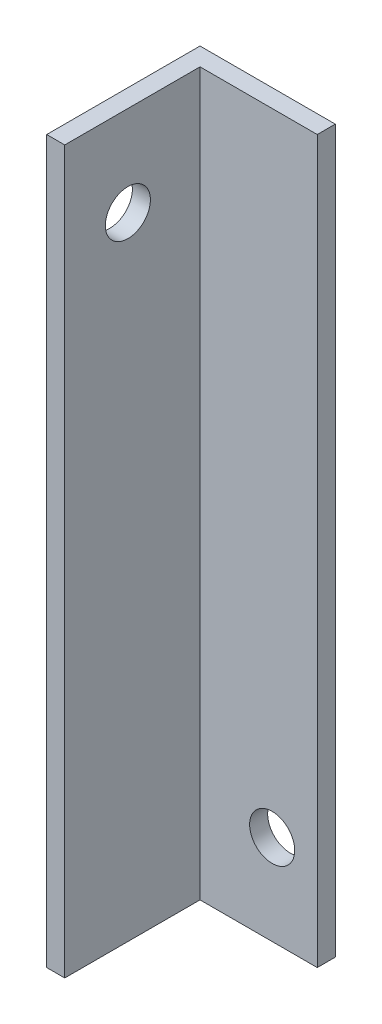
ISO-10303-21;
HEADER;
FILE_DESCRIPTION(('STEP AP214'),'2;1');
FILE_NAME('part.step','',(''),(''),'','','');
FILE_SCHEMA(('AUTOMOTIVE_DESIGN { 1 0 10303 214 1 1 1 1 }'));
ENDSEC;
DATA;
#1=APPLICATION_CONTEXT('core data for automotive mechanical design processes');
#2=APPLICATION_PROTOCOL_DEFINITION('international standard','automotive_design',2000,#1);
#3=PRODUCT_CONTEXT('',#1,'mechanical');
#4=PRODUCT('Part','Part','',(#3));
#5=PRODUCT_RELATED_PRODUCT_CATEGORY('part','',(#4));
#6=PRODUCT_DEFINITION_FORMATION('','',#4);
#7=PRODUCT_DEFINITION_CONTEXT('part definition',#1,'design');
#8=PRODUCT_DEFINITION('design','',#6,#7);
#9=PRODUCT_DEFINITION_SHAPE('','',#8);
#10=(LENGTH_UNIT() NAMED_UNIT(*) SI_UNIT(.MILLI.,.METRE.));
#11=(NAMED_UNIT(*) PLANE_ANGLE_UNIT() SI_UNIT($,.RADIAN.));
#12=(NAMED_UNIT(*) SI_UNIT($,.STERADIAN.) SOLID_ANGLE_UNIT());
#13=UNCERTAINTY_MEASURE_WITH_UNIT(LENGTH_MEASURE(1.E-05),#10,'distance_accuracy_value','');
#14=(GEOMETRIC_REPRESENTATION_CONTEXT(3) GLOBAL_UNCERTAINTY_ASSIGNED_CONTEXT((#13)) GLOBAL_UNIT_ASSIGNED_CONTEXT((#10,
#11,#12)) REPRESENTATION_CONTEXT('',''));
#15=CARTESIAN_POINT('',(0.,0.,0.));
#16=DIRECTION('',(0.,0.,1.));
#17=DIRECTION('',(1.,0.,0.));
#18=AXIS2_PLACEMENT_3D('',#15,#16,#17);
#19=CARTESIAN_POINT('',(0.,0.,2.));
#20=DIRECTION('',(1.,0.,0.));
#21=DIRECTION('',(0.,1.,0.));
#22=AXIS2_PLACEMENT_3D('',#19,#20,#21);
#23=PLANE('',#22);
#24=CARTESIAN_POINT('',(0.,-10.,10.));
#25=DIRECTION('',(-1.,0.,0.));
#26=DIRECTION('',(0.,-1.,0.));
#27=AXIS2_PLACEMENT_3D('',#24,#25,#26);
#28=CIRCLE('',#27,2.5);
#29=CARTESIAN_POINT('',(0.,-12.5,10.));
#30=VERTEX_POINT('',#29);
#31=EDGE_CURVE('E148',#30,#30,#28,.T.);
#32=ORIENTED_EDGE('',*,*,#31,.F.);
#33=EDGE_LOOP('',(#32));
#34=FACE_BOUND('',#33,.T.);
#35=DIRECTION('',(0.,-1.,0.));
#36=VECTOR('',#35,1.);
#37=CARTESIAN_POINT('',(0.,0.,0.));
#38=LINE('',#37,#36);
#39=CARTESIAN_POINT('',(0.,0.,0.));
#40=VERTEX_POINT('',#39);
#41=CARTESIAN_POINT('',(0.,-80.,0.));
#42=VERTEX_POINT('',#41);
#43=EDGE_CURVE('E93',#40,#42,#38,.T.);
#44=ORIENTED_EDGE('',*,*,#43,.T.);
#45=DIRECTION('',(0.,0.,-1.));
#46=VECTOR('',#45,1.);
#47=CARTESIAN_POINT('',(0.,-80.,2.));
#48=LINE('',#47,#46);
#49=CARTESIAN_POINT('',(0.,-80.,17.));
#50=VERTEX_POINT('',#49);
#51=EDGE_CURVE('E11',#50,#42,#48,.T.);
#52=ORIENTED_EDGE('',*,*,#51,.F.);
#53=DIRECTION('',(0.,-1.,0.));
#54=VECTOR('',#53,1.);
#55=CARTESIAN_POINT('',(0.,0.,17.));
#56=LINE('',#55,#54);
#57=CARTESIAN_POINT('',(0.,0.,17.));
#58=VERTEX_POINT('',#57);
#59=EDGE_CURVE('E95',#58,#50,#56,.T.);
#60=ORIENTED_EDGE('',*,*,#59,.F.);
#61=DIRECTION('',(0.,0.,-1.));
#62=VECTOR('',#61,1.);
#63=CARTESIAN_POINT('',(0.,0.,2.));
#64=LINE('',#63,#62);
#65=EDGE_CURVE('E79',#58,#40,#64,.T.);
#66=ORIENTED_EDGE('',*,*,#65,.T.);
#67=EDGE_LOOP('',(#44,#52,#60,#66));
#68=FACE_BOUND('',#67,.T.);
#69=ADVANCED_FACE('F33',(#34,#68),#23,.F.);
#70=CARTESIAN_POINT('',(0.,-80.,2.));
#71=DIRECTION('',(0.,1.,0.));
#72=DIRECTION('',(0.,0.,1.));
#73=AXIS2_PLACEMENT_3D('',#70,#71,#72);
#74=PLANE('',#73);
#75=DIRECTION('',(1.,0.,0.));
#76=VECTOR('',#75,1.);
#77=CARTESIAN_POINT('',(0.,-80.,0.));
#78=LINE('',#77,#76);
#79=CARTESIAN_POINT('',(15.,-80.,0.));
#80=VERTEX_POINT('',#79);
#81=EDGE_CURVE('E99',#42,#80,#78,.T.);
#82=ORIENTED_EDGE('',*,*,#81,.T.);
#83=DIRECTION('',(0.,0.,-1.));
#84=VECTOR('',#83,1.);
#85=CARTESIAN_POINT('',(15.,-80.,2.));
#86=LINE('',#85,#84);
#87=CARTESIAN_POINT('',(15.,-80.,2.));
#88=VERTEX_POINT('',#87);
#89=EDGE_CURVE('E41',#88,#80,#86,.T.);
#90=ORIENTED_EDGE('',*,*,#89,.F.);
#91=DIRECTION('',(1.,0.,0.));
#92=VECTOR('',#91,1.);
#93=CARTESIAN_POINT('',(0.,-80.,2.));
#94=LINE('',#93,#92);
#95=CARTESIAN_POINT('',(2.00000000000001,-80.,2.));
#96=VERTEX_POINT('',#95);
#97=EDGE_CURVE('E86',#96,#88,#94,.T.);
#98=ORIENTED_EDGE('',*,*,#97,.F.);
#99=DIRECTION('',(0.,0.,-1.));
#100=VECTOR('',#99,1.);
#101=CARTESIAN_POINT('',(2.00000000000001,-80.,17.));
#102=LINE('',#101,#100);
#103=CARTESIAN_POINT('',(2.00000000000001,-80.,17.));
#104=VERTEX_POINT('',#103);
#105=EDGE_CURVE('E100',#104,#96,#102,.T.);
#106=ORIENTED_EDGE('',*,*,#105,.F.);
#107=DIRECTION('',(1.,0.,0.));
#108=VECTOR('',#107,1.);
#109=CARTESIAN_POINT('',(0.,-80.,17.));
#110=LINE('',#109,#108);
#111=EDGE_CURVE('E152',#50,#104,#110,.T.);
#112=ORIENTED_EDGE('',*,*,#111,.F.);
#113=ORIENTED_EDGE('',*,*,#51,.T.);
#114=EDGE_LOOP('',(#82,#90,#98,#106,#112,#113));
#115=FACE_BOUND('',#114,.T.);
#116=ADVANCED_FACE('F165',(#115),#74,.F.);
#117=CARTESIAN_POINT('',(15.,0.,2.));
#118=DIRECTION('',(-1.,0.,0.));
#119=DIRECTION('',(0.,-1.,0.));
#120=AXIS2_PLACEMENT_3D('',#117,#118,#119);
#121=PLANE('',#120);
#122=DIRECTION('',(0.,1.,0.));
#123=VECTOR('',#122,1.);
#124=CARTESIAN_POINT('',(15.,0.,0.));
#125=LINE('',#124,#123);
#126=CARTESIAN_POINT('',(15.,0.,0.));
#127=VERTEX_POINT('',#126);
#128=EDGE_CURVE('E87',#80,#127,#125,.T.);
#129=ORIENTED_EDGE('',*,*,#128,.T.);
#130=DIRECTION('',(0.,0.,-1.));
#131=VECTOR('',#130,1.);
#132=CARTESIAN_POINT('',(15.,0.,2.));
#133=LINE('',#132,#131);
#134=CARTESIAN_POINT('',(15.,0.,2.));
#135=VERTEX_POINT('',#134);
#136=EDGE_CURVE('E82',#135,#127,#133,.T.);
#137=ORIENTED_EDGE('',*,*,#136,.F.);
#138=DIRECTION('',(0.,1.,0.));
#139=VECTOR('',#138,1.);
#140=CARTESIAN_POINT('',(15.,0.,2.));
#141=LINE('',#140,#139);
#142=EDGE_CURVE('E55',#88,#135,#141,.T.);
#143=ORIENTED_EDGE('',*,*,#142,.F.);
#144=ORIENTED_EDGE('',*,*,#89,.T.);
#145=EDGE_LOOP('',(#129,#137,#143,#144));
#146=FACE_BOUND('',#145,.T.);
#147=ADVANCED_FACE('F168',(#146),#121,.F.);
#148=CARTESIAN_POINT('',(0.,0.,2.));
#149=DIRECTION('',(0.,-1.,0.));
#150=DIRECTION('',(0.,0.,-1.));
#151=AXIS2_PLACEMENT_3D('',#148,#149,#150);
#152=PLANE('',#151);
#153=DIRECTION('',(-1.,0.,0.));
#154=VECTOR('',#153,1.);
#155=CARTESIAN_POINT('',(0.,0.,0.));
#156=LINE('',#155,#154);
#157=EDGE_CURVE('E75',#127,#40,#156,.T.);
#158=ORIENTED_EDGE('',*,*,#157,.T.);
#159=ORIENTED_EDGE('',*,*,#65,.F.);
#160=DIRECTION('',(-1.,0.,0.));
#161=VECTOR('',#160,1.);
#162=CARTESIAN_POINT('',(0.,0.,17.));
#163=LINE('',#162,#161);
#164=CARTESIAN_POINT('',(2.,0.,17.));
#165=VERTEX_POINT('',#164);
#166=EDGE_CURVE('E132',#165,#58,#163,.T.);
#167=ORIENTED_EDGE('',*,*,#166,.F.);
#168=DIRECTION('',(0.,0.,-1.));
#169=VECTOR('',#168,1.);
#170=CARTESIAN_POINT('',(2.,0.,17.));
#171=LINE('',#170,#169);
#172=CARTESIAN_POINT('',(2.,0.,2.));
#173=VERTEX_POINT('',#172);
#174=EDGE_CURVE('E104',#165,#173,#171,.T.);
#175=ORIENTED_EDGE('',*,*,#174,.T.);
#176=DIRECTION('',(-1.,0.,0.));
#177=VECTOR('',#176,1.);
#178=CARTESIAN_POINT('',(0.,0.,2.));
#179=LINE('',#178,#177);
#180=EDGE_CURVE('E96',#135,#173,#179,.T.);
#181=ORIENTED_EDGE('',*,*,#180,.F.);
#182=ORIENTED_EDGE('',*,*,#136,.T.);
#183=EDGE_LOOP('',(#158,#159,#167,#175,#181,#182));
#184=FACE_BOUND('',#183,.T.);
#185=ADVANCED_FACE('F77',(#184),#152,.F.);
#186=CARTESIAN_POINT('',(0.,0.,2.));
#187=DIRECTION('',(0.,0.,1.));
#188=DIRECTION('',(1.,0.,0.));
#189=AXIS2_PLACEMENT_3D('',#186,#187,#188);
#190=PLANE('',#189);
#191=CARTESIAN_POINT('',(10.,-70.,2.));
#192=DIRECTION('',(0.,0.,1.));
#193=DIRECTION('',(1.,0.,0.));
#194=AXIS2_PLACEMENT_3D('',#191,#192,#193);
#195=CIRCLE('',#194,2.5);
#196=CARTESIAN_POINT('',(12.5,-70.,2.));
#197=VERTEX_POINT('',#196);
#198=EDGE_CURVE('E140',#197,#197,#195,.T.);
#199=ORIENTED_EDGE('',*,*,#198,.F.);
#200=EDGE_LOOP('',(#199));
#201=FACE_BOUND('',#200,.T.);
#202=DIRECTION('',(0.,1.,0.));
#203=VECTOR('',#202,1.);
#204=CARTESIAN_POINT('',(2.,0.,2.));
#205=LINE('',#204,#203);
#206=EDGE_CURVE('E49',#96,#173,#205,.T.);
#207=ORIENTED_EDGE('',*,*,#206,.F.);
#208=ORIENTED_EDGE('',*,*,#97,.T.);
#209=ORIENTED_EDGE('',*,*,#142,.T.);
#210=ORIENTED_EDGE('',*,*,#180,.T.);
#211=EDGE_LOOP('',(#207,#208,#209,#210));
#212=FACE_BOUND('',#211,.T.);
#213=ADVANCED_FACE('F122',(#201,#212),#190,.T.);
#214=CARTESIAN_POINT('',(0.,0.,0.));
#215=DIRECTION('',(0.,0.,1.));
#216=DIRECTION('',(1.,0.,0.));
#217=AXIS2_PLACEMENT_3D('',#214,#215,#216);
#218=PLANE('',#217);
#219=CARTESIAN_POINT('',(10.,-70.,0.));
#220=DIRECTION('',(0.,0.,1.));
#221=DIRECTION('',(1.,0.,0.));
#222=AXIS2_PLACEMENT_3D('',#219,#220,#221);
#223=CIRCLE('',#222,2.5);
#224=CARTESIAN_POINT('',(12.5,-70.,0.));
#225=VERTEX_POINT('',#224);
#226=EDGE_CURVE('E131',#225,#225,#223,.T.);
#227=ORIENTED_EDGE('',*,*,#226,.T.);
#228=EDGE_LOOP('',(#227));
#229=FACE_BOUND('',#228,.T.);
#230=ORIENTED_EDGE('',*,*,#43,.F.);
#231=ORIENTED_EDGE('',*,*,#157,.F.);
#232=ORIENTED_EDGE('',*,*,#128,.F.);
#233=ORIENTED_EDGE('',*,*,#81,.F.);
#234=EDGE_LOOP('',(#230,#231,#232,#233));
#235=FACE_BOUND('',#234,.T.);
#236=ADVANCED_FACE('F98',(#229,#235),#218,.F.);
#237=CARTESIAN_POINT('',(2.,0.,17.));
#238=DIRECTION('',(-1.,0.,0.));
#239=DIRECTION('',(0.,-1.,0.));
#240=AXIS2_PLACEMENT_3D('',#237,#238,#239);
#241=PLANE('',#240);
#242=CARTESIAN_POINT('',(2.,-10.,10.));
#243=DIRECTION('',(-1.,0.,0.));
#244=DIRECTION('',(0.,-1.,0.));
#245=AXIS2_PLACEMENT_3D('',#242,#243,#244);
#246=CIRCLE('',#245,2.5);
#247=CARTESIAN_POINT('',(2.,-12.5,10.));
#248=VERTEX_POINT('',#247);
#249=EDGE_CURVE('E36',#248,#248,#246,.T.);
#250=ORIENTED_EDGE('',*,*,#249,.T.);
#251=EDGE_LOOP('',(#250));
#252=FACE_BOUND('',#251,.T.);
#253=ORIENTED_EDGE('',*,*,#206,.T.);
#254=ORIENTED_EDGE('',*,*,#174,.F.);
#255=DIRECTION('',(0.,1.,0.));
#256=VECTOR('',#255,1.);
#257=CARTESIAN_POINT('',(2.,0.,17.));
#258=LINE('',#257,#256);
#259=EDGE_CURVE('E134',#104,#165,#258,.T.);
#260=ORIENTED_EDGE('',*,*,#259,.F.);
#261=ORIENTED_EDGE('',*,*,#105,.T.);
#262=EDGE_LOOP('',(#253,#254,#260,#261));
#263=FACE_BOUND('',#262,.T.);
#264=ADVANCED_FACE('F127',(#252,#263),#241,.F.);
#265=CARTESIAN_POINT('',(0.,0.,17.));
#266=DIRECTION('',(0.,0.,1.));
#267=DIRECTION('',(1.,0.,0.));
#268=AXIS2_PLACEMENT_3D('',#265,#266,#267);
#269=PLANE('',#268);
#270=ORIENTED_EDGE('',*,*,#59,.T.);
#271=ORIENTED_EDGE('',*,*,#111,.T.);
#272=ORIENTED_EDGE('',*,*,#259,.T.);
#273=ORIENTED_EDGE('',*,*,#166,.T.);
#274=EDGE_LOOP('',(#270,#271,#272,#273));
#275=FACE_BOUND('',#274,.T.);
#276=ADVANCED_FACE('F157',(#275),#269,.T.);
#277=CARTESIAN_POINT('',(10.,-70.,-18.));
#278=DIRECTION('',(0.,0.,1.));
#279=DIRECTION('',(1.,0.,0.));
#280=AXIS2_PLACEMENT_3D('',#277,#278,#279);
#281=CYLINDRICAL_SURFACE('',#280,2.5);
#282=ORIENTED_EDGE('',*,*,#198,.T.);
#283=EDGE_LOOP('',(#282));
#284=FACE_BOUND('',#283,.T.);
#285=ORIENTED_EDGE('',*,*,#226,.F.);
#286=EDGE_LOOP('',(#285));
#287=FACE_BOUND('',#286,.T.);
#288=ADVANCED_FACE('F186',(#284,#287),#281,.F.);
#289=CARTESIAN_POINT('',(20.,-10.,10.));
#290=DIRECTION('',(-1.,0.,0.));
#291=DIRECTION('',(0.,-1.,0.));
#292=AXIS2_PLACEMENT_3D('',#289,#290,#291);
#293=CYLINDRICAL_SURFACE('',#292,2.5);
#294=ORIENTED_EDGE('',*,*,#31,.T.);
#295=EDGE_LOOP('',(#294));
#296=FACE_BOUND('',#295,.T.);
#297=ORIENTED_EDGE('',*,*,#249,.F.);
#298=EDGE_LOOP('',(#297));
#299=FACE_BOUND('',#298,.T.);
#300=ADVANCED_FACE('F183',(#296,#299),#293,.F.);
#301=CLOSED_SHELL('',(#69,#116,#147,#185,#213,#236,#264,#276,#288,#300));
#302=MANIFOLD_SOLID_BREP('B2',#301);
#303=ADVANCED_BREP_SHAPE_REPRESENTATION('',(#18,#302),#14);
#304=SHAPE_DEFINITION_REPRESENTATION(#9,#303);
ENDSEC;
END-ISO-10303-21;
